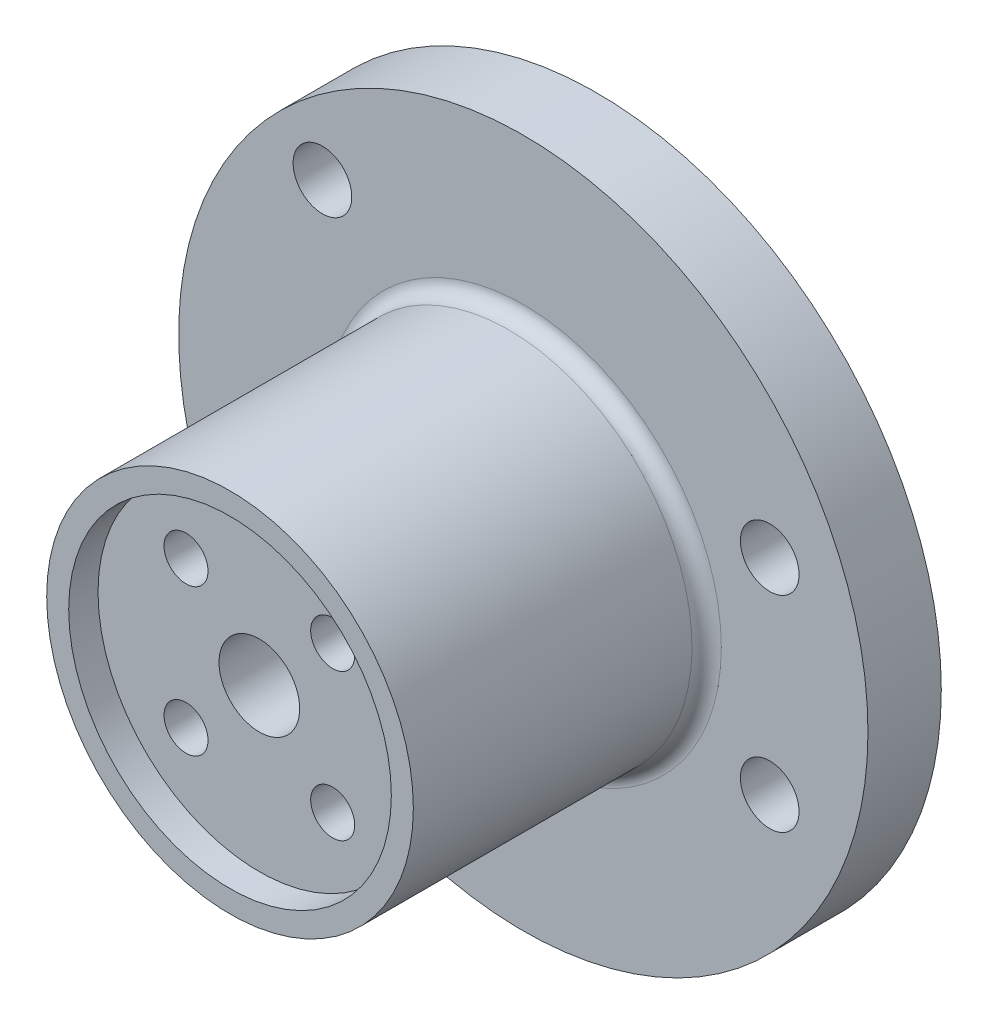
ISO-10303-21;
HEADER;
FILE_DESCRIPTION(('STEP AP214'),'2;1');
FILE_NAME('part.step','',(''),(''),'','','');
FILE_SCHEMA(('AUTOMOTIVE_DESIGN { 1 0 10303 214 1 1 1 1 }'));
ENDSEC;
DATA;
#1=APPLICATION_CONTEXT('core data for automotive mechanical design processes');
#2=APPLICATION_PROTOCOL_DEFINITION('international standard','automotive_design',2000,#1);
#3=PRODUCT_CONTEXT('',#1,'mechanical');
#4=PRODUCT('Part','Part','',(#3));
#5=PRODUCT_RELATED_PRODUCT_CATEGORY('part','',(#4));
#6=PRODUCT_DEFINITION_FORMATION('','',#4);
#7=PRODUCT_DEFINITION_CONTEXT('part definition',#1,'design');
#8=PRODUCT_DEFINITION('design','',#6,#7);
#9=PRODUCT_DEFINITION_SHAPE('','',#8);
#10=(LENGTH_UNIT() NAMED_UNIT(*) SI_UNIT(.MILLI.,.METRE.));
#11=(NAMED_UNIT(*) PLANE_ANGLE_UNIT() SI_UNIT($,.RADIAN.));
#12=(NAMED_UNIT(*) SI_UNIT($,.STERADIAN.) SOLID_ANGLE_UNIT());
#13=UNCERTAINTY_MEASURE_WITH_UNIT(LENGTH_MEASURE(1.E-05),#10,'distance_accuracy_value','');
#14=(GEOMETRIC_REPRESENTATION_CONTEXT(3) GLOBAL_UNCERTAINTY_ASSIGNED_CONTEXT((#13)) GLOBAL_UNIT_ASSIGNED_CONTEXT((#10,
#11,#12)) REPRESENTATION_CONTEXT('',''));
#15=CARTESIAN_POINT('',(0.,0.,0.));
#16=DIRECTION('',(0.,0.,1.));
#17=DIRECTION('',(1.,0.,0.));
#18=AXIS2_PLACEMENT_3D('',#15,#16,#17);
#19=CARTESIAN_POINT('',(0.,-29.8340703930584,6.));
#20=DIRECTION('',(0.,0.,1.));
#21=DIRECTION('',(1.,0.,0.));
#22=AXIS2_PLACEMENT_3D('',#19,#20,#21);
#23=TOROIDAL_SURFACE('',#22,13.5,1.);
#24=CARTESIAN_POINT('',(0.,-29.8340703930584,6.));
#25=DIRECTION('',(0.,0.,1.));
#26=DIRECTION('',(1.,0.,0.));
#27=AXIS2_PLACEMENT_3D('',#24,#25,#26);
#28=CIRCLE('',#27,12.5);
#29=CARTESIAN_POINT('',(-12.40650072647,-31.360091272364,5.99999999999442));
#30=VERTEX_POINT('',#29);
#31=CARTESIAN_POINT('',(-12.3661631385171,-28.009787182704,6.));
#32=VERTEX_POINT('',#31);
#33=EDGE_CURVE('E175',#30,#32,#28,.T.);
#34=ORIENTED_EDGE('',*,*,#33,.F.);
#35=CARTESIAN_POINT('',(-13.3554561895985,-31.8042962602411,5.));
#36=CARTESIAN_POINT('',(-13.3292068947137,-31.7997184325011,4.99999850446996));
#37=CARTESIAN_POINT('',(-13.3030646975041,-31.7946124959136,5.00106493962902));
#38=CARTESIAN_POINT('',(-13.2511789138633,-31.7834072289094,5.0053014427434));
#39=CARTESIAN_POINT('',(-13.2254351480004,-31.7773083608055,5.0084705337958));
#40=CARTESIAN_POINT('',(-13.1493376434393,-31.7576857602603,5.02103607347123));
#41=CARTESIAN_POINT('',(-13.0998084479632,-31.7427813223031,5.03349164906623));
#42=CARTESIAN_POINT('',(-13.0044248926745,-31.7101652013147,5.06595625826841));
#43=CARTESIAN_POINT('',(-12.9585655251529,-31.6924574454327,5.08595477840818));
#44=CARTESIAN_POINT('',(-12.871232035897,-31.6552251669885,5.13277486464714));
#45=CARTESIAN_POINT('',(-12.8297629554166,-31.6356986032597,5.15960415657287));
#46=CARTESIAN_POINT('',(-12.7491538733143,-31.5945986229179,5.22139124017293));
#47=CARTESIAN_POINT('',(-12.7103707653643,-31.5729768394816,5.25678147737277));
#48=CARTESIAN_POINT('',(-12.6389926718412,-31.5304005373566,5.33373846242347));
#49=CARTESIAN_POINT('',(-12.6064037908923,-31.5094466936945,5.37531123220725));
#50=CARTESIAN_POINT('',(-12.5454399584442,-31.4681256694827,5.46768145986754));
#51=CARTESIAN_POINT('',(-12.5176563243858,-31.4479587599013,5.51896213681349));
#52=CARTESIAN_POINT('',(-12.4708135773237,-31.4126000264803,5.62688430991694));
#53=CARTESIAN_POINT('',(-12.4517307212237,-31.3973946959248,5.6835107018308));
#54=CARTESIAN_POINT('',(-12.4308995728189,-31.3804524020772,5.76873220725052));
#55=CARTESIAN_POINT('',(-12.4253611379429,-31.3758817641364,5.79589210294517));
#56=CARTESIAN_POINT('',(-12.4163612546308,-31.3684015010736,5.85078476788693));
#57=CARTESIAN_POINT('',(-12.4128994134233,-31.3654915618485,5.87851742777301));
#58=CARTESIAN_POINT('',(-12.4080921945597,-31.3614419425646,5.93454876858016));
#59=CARTESIAN_POINT('',(-12.4067663182499,-31.3603185750688,5.9628503024696));
#60=CARTESIAN_POINT('',(-12.4063061253253,-31.3599241060825,6.01950862829392));
#61=CARTESIAN_POINT('',(-12.4071737458626,-31.3606546418396,6.04786544695758));
#62=CARTESIAN_POINT('',(-12.4091464904235,-31.3623287039546,6.07609289479795));
#63=B_SPLINE_CURVE_WITH_KNOTS('',3,(#35,#36,#37,#38,#39,#40,#41,#42,#43,#44,#45,#46,#47,#48,#49,
#50,#51,#52,#53,#54,#55,#56,#57,#58,#59,#60,#61,#62),.UNSPECIFIED.,.F.,.F.,(4,2,2,2,2,2,2,2,2,2,
2,2,2,4),(0.,0.0798815939149104,0.159726100463871,0.318486078900469,0.477025588195234,
0.635745213678908,0.805391891249494,0.975204904268246,1.15941157978579,1.34311252983149,
1.4272840659603,1.5114396766743,1.59635936012578,1.68135406524653),.UNSPECIFIED.);
#64=CARTESIAN_POINT('',(-13.3554561895985,-31.8042962602411,5.));
#65=VERTEX_POINT('',#64);
#66=EDGE_CURVE('E82',#30,#65,#63,.F.);
#67=ORIENTED_EDGE('',*,*,#66,.T.);
#68=CARTESIAN_POINT('',(0.,-29.8340703930584,5.));
#69=DIRECTION('',(0.,0.,1.));
#70=DIRECTION('',(1.,0.,0.));
#71=AXIS2_PLACEMENT_3D('',#68,#69,#70);
#72=CIRCLE('',#71,13.5);
#73=CARTESIAN_POINT('',(-13.3554561895985,-27.8638445258757,5.));
#74=VERTEX_POINT('',#73);
#75=EDGE_CURVE('E177',#74,#65,#72,.F.);
#76=ORIENTED_EDGE('',*,*,#75,.F.);
#77=CARTESIAN_POINT('',(-13.3554561895985,-27.8638445258757,5.));
#78=CARTESIAN_POINT('',(-13.3292068947137,-27.8684223536157,4.99999850446996));
#79=CARTESIAN_POINT('',(-13.3030646975041,-27.8735282902032,5.00106493962902));
#80=CARTESIAN_POINT('',(-13.2511789138633,-27.8847335572073,5.0053014427434));
#81=CARTESIAN_POINT('',(-13.2254351480004,-27.8908324253113,5.0084705337958));
#82=CARTESIAN_POINT('',(-13.1493376434393,-27.9104550258564,5.02103607347123));
#83=CARTESIAN_POINT('',(-13.0998084479632,-27.9253594638136,5.03349164906623));
#84=CARTESIAN_POINT('',(-13.0044248926745,-27.957975584802,5.06595625826841));
#85=CARTESIAN_POINT('',(-12.9585655251529,-27.975683340684,5.08595477840818));
#86=CARTESIAN_POINT('',(-12.871232035897,-28.0129156191282,5.13277486464714));
#87=CARTESIAN_POINT('',(-12.8297629554166,-28.032442182857,5.15960415657288));
#88=CARTESIAN_POINT('',(-12.7491538733143,-28.0735421631989,5.22139124017293));
#89=CARTESIAN_POINT('',(-12.7103707653643,-28.0951639466351,5.25678147737278));
#90=CARTESIAN_POINT('',(-12.6389926718412,-28.1377402487602,5.33373846242347));
#91=CARTESIAN_POINT('',(-12.6064037908923,-28.1586940924222,5.37531123220725));
#92=CARTESIAN_POINT('',(-12.5454399584442,-28.2000151166341,5.46768145986754));
#93=CARTESIAN_POINT('',(-12.5176563243858,-28.2201820262154,5.51896213681349));
#94=CARTESIAN_POINT('',(-12.4708135773237,-28.2555407596364,5.62688430991694));
#95=CARTESIAN_POINT('',(-12.4517307212237,-28.2707460901919,5.6835107018308));
#96=CARTESIAN_POINT('',(-12.4308995728189,-28.2876883840395,5.76873220725053));
#97=CARTESIAN_POINT('',(-12.4253611379429,-28.2922590219804,5.79589210294518));
#98=CARTESIAN_POINT('',(-12.4163612546308,-28.2997392850432,5.85078476788693));
#99=CARTESIAN_POINT('',(-12.4128994134233,-28.3026492242683,5.87851742777301));
#100=CARTESIAN_POINT('',(-12.4080921945597,-28.3066988435521,5.93454876858016));
#101=CARTESIAN_POINT('',(-12.4067663182499,-28.3078222110479,5.96285030246961));
#102=CARTESIAN_POINT('',(-12.4063061253253,-28.3082166800342,6.01950862829392));
#103=CARTESIAN_POINT('',(-12.4071737458626,-28.3074861442771,6.04786544695759));
#104=CARTESIAN_POINT('',(-12.4091464904235,-28.3058120821621,6.07609289479795));
#105=B_SPLINE_CURVE_WITH_KNOTS('',3,(#77,#78,#79,#80,#81,#82,#83,#84,#85,#86,#87,#88,#89,#90,
#91,#92,#93,#94,#95,#96,#97,#98,#99,#100,#101,#102,#103,#104),.UNSPECIFIED.,.F.,.F.,(4,2,2,2,2,
2,2,2,2,2,2,2,2,4),(0.,0.0798815939149111,0.159726100463873,0.318486078900472,0.477025588195239,
0.635745213678914,0.805391891249495,0.975204904268246,1.15941157978579,1.3431125298315,
1.4272840659603,1.5114396766743,1.59635936012579,1.68135406524653),.UNSPECIFIED.);
#106=CARTESIAN_POINT('',(-12.406500726471,-28.3080495137533,5.99999999999442));
#107=VERTEX_POINT('',#106);
#108=EDGE_CURVE('E12',#74,#107,#105,.T.);
#109=ORIENTED_EDGE('',*,*,#108,.T.);
#110=CARTESIAN_POINT('',(0.,-29.8340703930584,6.));
#111=DIRECTION('',(0.,0.,1.));
#112=DIRECTION('',(1.,0.,0.));
#113=AXIS2_PLACEMENT_3D('',#110,#111,#112);
#114=CIRCLE('',#113,12.5);
#115=EDGE_CURVE('E123',#32,#107,#114,.T.);
#116=ORIENTED_EDGE('',*,*,#115,.F.);
#117=EDGE_LOOP('',(#34,#67,#76,#109,#116));
#118=FACE_BOUND('',#117,.T.);
#119=ADVANCED_FACE('F69',(#118),#23,.F.);
#120=CARTESIAN_POINT('',(-5.00000000000002,-24.8340703930584,0.));
#121=DIRECTION('',(0.,0.,1.));
#122=DIRECTION('',(1.,0.,0.));
#123=AXIS2_PLACEMENT_3D('',#120,#121,#122);
#124=CYLINDRICAL_SURFACE('',#123,1.5);
#125=CARTESIAN_POINT('',(-5.00000000000002,-24.8340703930584,23.));
#126=DIRECTION('',(0.,0.,1.));
#127=DIRECTION('',(1.,0.,0.));
#128=AXIS2_PLACEMENT_3D('',#125,#126,#127);
#129=CIRCLE('',#128,1.5);
#130=CARTESIAN_POINT('',(-3.50000000000002,-24.8340703930584,23.));
#131=VERTEX_POINT('',#130);
#132=EDGE_CURVE('E129',#131,#131,#129,.F.);
#133=ORIENTED_EDGE('',*,*,#132,.F.);
#134=EDGE_LOOP('',(#133));
#135=FACE_BOUND('',#134,.T.);
#136=CARTESIAN_POINT('',(-5.00000000000002,-24.8340703930584,20.));
#137=DIRECTION('',(0.,0.,-1.));
#138=DIRECTION('',(-1.,0.,0.));
#139=AXIS2_PLACEMENT_3D('',#136,#137,#138);
#140=CIRCLE('',#139,1.5);
#141=CARTESIAN_POINT('',(-6.50000000000003,-24.8340703930584,20.));
#142=VERTEX_POINT('',#141);
#143=EDGE_CURVE('E260',#142,#142,#140,.F.);
#144=ORIENTED_EDGE('',*,*,#143,.F.);
#145=EDGE_LOOP('',(#144));
#146=FACE_BOUND('',#145,.T.);
#147=ADVANCED_FACE('F217',(#135,#146),#124,.F.);
#148=CARTESIAN_POINT('',(-5.00000000000003,-34.8340703930584,0.));
#149=DIRECTION('',(0.,0.,1.));
#150=DIRECTION('',(1.,0.,0.));
#151=AXIS2_PLACEMENT_3D('',#148,#149,#150);
#152=CYLINDRICAL_SURFACE('',#151,1.5);
#153=CARTESIAN_POINT('',(-5.00000000000003,-34.8340703930584,23.));
#154=DIRECTION('',(0.,0.,1.));
#155=DIRECTION('',(1.,0.,0.));
#156=AXIS2_PLACEMENT_3D('',#153,#154,#155);
#157=CIRCLE('',#156,1.5);
#158=CARTESIAN_POINT('',(-3.50000000000003,-34.8340703930584,23.));
#159=VERTEX_POINT('',#158);
#160=EDGE_CURVE('E134',#159,#159,#157,.F.);
#161=ORIENTED_EDGE('',*,*,#160,.F.);
#162=EDGE_LOOP('',(#161));
#163=FACE_BOUND('',#162,.T.);
#164=CARTESIAN_POINT('',(-5.00000000000003,-34.8340703930584,20.));
#165=DIRECTION('',(0.,0.,-1.));
#166=DIRECTION('',(-1.,0.,0.));
#167=AXIS2_PLACEMENT_3D('',#164,#165,#166);
#168=CIRCLE('',#167,1.5);
#169=CARTESIAN_POINT('',(-6.50000000000003,-34.8340703930584,20.));
#170=VERTEX_POINT('',#169);
#171=EDGE_CURVE('E251',#170,#170,#168,.F.);
#172=ORIENTED_EDGE('',*,*,#171,.F.);
#173=EDGE_LOOP('',(#172));
#174=FACE_BOUND('',#173,.T.);
#175=ADVANCED_FACE('F222',(#163,#174),#152,.F.);
#176=CARTESIAN_POINT('',(4.99999999999997,-34.8340703930584,0.));
#177=DIRECTION('',(0.,0.,1.));
#178=DIRECTION('',(1.,0.,0.));
#179=AXIS2_PLACEMENT_3D('',#176,#177,#178);
#180=CYLINDRICAL_SURFACE('',#179,1.5);
#181=CARTESIAN_POINT('',(4.99999999999997,-34.8340703930584,23.));
#182=DIRECTION('',(0.,0.,1.));
#183=DIRECTION('',(1.,0.,0.));
#184=AXIS2_PLACEMENT_3D('',#181,#182,#183);
#185=CIRCLE('',#184,1.5);
#186=CARTESIAN_POINT('',(6.49999999999997,-34.8340703930584,23.));
#187=VERTEX_POINT('',#186);
#188=EDGE_CURVE('E172',#187,#187,#185,.F.);
#189=ORIENTED_EDGE('',*,*,#188,.F.);
#190=EDGE_LOOP('',(#189));
#191=FACE_BOUND('',#190,.T.);
#192=CARTESIAN_POINT('',(4.99999999999997,-34.8340703930584,20.));
#193=DIRECTION('',(0.,0.,-1.));
#194=DIRECTION('',(-1.,0.,0.));
#195=AXIS2_PLACEMENT_3D('',#192,#193,#194);
#196=CIRCLE('',#195,1.5);
#197=CARTESIAN_POINT('',(3.49999999999997,-34.8340703930584,20.));
#198=VERTEX_POINT('',#197);
#199=EDGE_CURVE('E271',#198,#198,#196,.F.);
#200=ORIENTED_EDGE('',*,*,#199,.F.);
#201=EDGE_LOOP('',(#200));
#202=FACE_BOUND('',#201,.T.);
#203=ADVANCED_FACE('F211',(#191,#202),#180,.F.);
#204=CARTESIAN_POINT('',(4.99999999999997,-24.8340703930584,0.));
#205=DIRECTION('',(0.,0.,1.));
#206=DIRECTION('',(1.,0.,0.));
#207=AXIS2_PLACEMENT_3D('',#204,#205,#206);
#208=CYLINDRICAL_SURFACE('',#207,1.5);
#209=CARTESIAN_POINT('',(4.99999999999997,-24.8340703930584,23.));
#210=DIRECTION('',(0.,0.,1.));
#211=DIRECTION('',(1.,0.,0.));
#212=AXIS2_PLACEMENT_3D('',#209,#210,#211);
#213=CIRCLE('',#212,1.5);
#214=CARTESIAN_POINT('',(6.49999999999997,-24.8340703930584,23.));
#215=VERTEX_POINT('',#214);
#216=EDGE_CURVE('E169',#215,#215,#213,.F.);
#217=ORIENTED_EDGE('',*,*,#216,.F.);
#218=EDGE_LOOP('',(#217));
#219=FACE_BOUND('',#218,.T.);
#220=CARTESIAN_POINT('',(4.99999999999997,-24.8340703930584,20.));
#221=DIRECTION('',(0.,0.,-1.));
#222=DIRECTION('',(-1.,0.,0.));
#223=AXIS2_PLACEMENT_3D('',#220,#221,#222);
#224=CIRCLE('',#223,1.5);
#225=CARTESIAN_POINT('',(3.49999999999997,-24.8340703930584,20.));
#226=VERTEX_POINT('',#225);
#227=EDGE_CURVE('E278',#226,#226,#224,.F.);
#228=ORIENTED_EDGE('',*,*,#227,.F.);
#229=EDGE_LOOP('',(#228));
#230=FACE_BOUND('',#229,.T.);
#231=ADVANCED_FACE('F206',(#219,#230),#208,.F.);
#232=CARTESIAN_POINT('',(0.,-29.8340703930584,5.));
#233=DIRECTION('',(0.,0.,-1.));
#234=DIRECTION('',(-1.,0.,0.));
#235=AXIS2_PLACEMENT_3D('',#232,#233,#234);
#236=CYLINDRICAL_SURFACE('',#235,23.5);
#237=CARTESIAN_POINT('',(0.,-29.8340703930584,5.));
#238=DIRECTION('',(0.,0.,1.));
#239=DIRECTION('',(1.,0.,0.));
#240=AXIS2_PLACEMENT_3D('',#237,#238,#239);
#241=CIRCLE('',#240,23.5);
#242=CARTESIAN_POINT('',(23.5,-29.8340703930584,5.));
#243=VERTEX_POINT('',#242);
#244=EDGE_CURVE('E163',#243,#243,#241,.T.);
#245=ORIENTED_EDGE('',*,*,#244,.F.);
#246=EDGE_LOOP('',(#245));
#247=FACE_BOUND('',#246,.T.);
#248=CARTESIAN_POINT('',(0.,-29.8340703930584,0.));
#249=DIRECTION('',(0.,0.,1.));
#250=DIRECTION('',(1.,0.,0.));
#251=AXIS2_PLACEMENT_3D('',#248,#249,#250);
#252=CIRCLE('',#251,23.5);
#253=CARTESIAN_POINT('',(23.5,-29.8340703930584,0.));
#254=VERTEX_POINT('',#253);
#255=EDGE_CURVE('E140',#254,#254,#252,.T.);
#256=ORIENTED_EDGE('',*,*,#255,.T.);
#257=EDGE_LOOP('',(#256));
#258=FACE_BOUND('',#257,.T.);
#259=ADVANCED_FACE('F201',(#247,#258),#236,.T.);
#260=CARTESIAN_POINT('',(0.,-29.8340703930584,5.));
#261=DIRECTION('',(0.,0.,1.));
#262=DIRECTION('',(1.,0.,0.));
#263=AXIS2_PLACEMENT_3D('',#260,#261,#262);
#264=PLANE('',#263);
#265=CARTESIAN_POINT('',(-13.6992730482373,-29.8340703930584,5.));
#266=DIRECTION('',(0.,0.,-1.));
#267=DIRECTION('',(-1.,0.,0.));
#268=AXIS2_PLACEMENT_3D('',#265,#266,#267);
#269=CIRCLE('',#268,2.);
#270=EDGE_CURVE('E118',#65,#74,#269,.T.);
#271=ORIENTED_EDGE('',*,*,#270,.T.);
#272=ORIENTED_EDGE('',*,*,#75,.T.);
#273=EDGE_LOOP('',(#271,#272));
#274=FACE_BOUND('',#273,.T.);
#275=CARTESIAN_POINT('',(-13.6992730482373,-15.8340703930584,5.));
#276=DIRECTION('',(0.,0.,-1.));
#277=DIRECTION('',(-1.,0.,0.));
#278=AXIS2_PLACEMENT_3D('',#275,#276,#277);
#279=CIRCLE('',#278,2.);
#280=CARTESIAN_POINT('',(-15.6992730482373,-15.8340703930584,5.));
#281=VERTEX_POINT('',#280);
#282=EDGE_CURVE('E137',#281,#281,#279,.T.);
#283=ORIENTED_EDGE('',*,*,#282,.T.);
#284=EDGE_LOOP('',(#283));
#285=FACE_BOUND('',#284,.T.);
#286=CARTESIAN_POINT('',(16.8007269517627,-36.8840703930584,5.));
#287=DIRECTION('',(0.,0.,-1.));
#288=DIRECTION('',(-1.,0.,0.));
#289=AXIS2_PLACEMENT_3D('',#286,#287,#288);
#290=CIRCLE('',#289,2.);
#291=CARTESIAN_POINT('',(14.8007269517627,-36.8840703930584,5.));
#292=VERTEX_POINT('',#291);
#293=EDGE_CURVE('E117',#292,#292,#290,.T.);
#294=ORIENTED_EDGE('',*,*,#293,.T.);
#295=EDGE_LOOP('',(#294));
#296=FACE_BOUND('',#295,.T.);
#297=CARTESIAN_POINT('',(16.8007269517627,-22.8840703930584,5.));
#298=DIRECTION('',(0.,0.,-1.));
#299=DIRECTION('',(-1.,0.,0.));
#300=AXIS2_PLACEMENT_3D('',#297,#298,#299);
#301=CIRCLE('',#300,2.);
#302=CARTESIAN_POINT('',(14.8007269517627,-22.8840703930584,5.));
#303=VERTEX_POINT('',#302);
#304=EDGE_CURVE('E148',#303,#303,#301,.T.);
#305=ORIENTED_EDGE('',*,*,#304,.T.);
#306=EDGE_LOOP('',(#305));
#307=FACE_BOUND('',#306,.T.);
#308=CARTESIAN_POINT('',(-13.6992730482373,-43.8340703930584,5.));
#309=DIRECTION('',(0.,0.,-1.));
#310=DIRECTION('',(-1.,0.,0.));
#311=AXIS2_PLACEMENT_3D('',#308,#309,#310);
#312=CIRCLE('',#311,2.);
#313=CARTESIAN_POINT('',(-15.6992730482373,-43.8340703930584,5.));
#314=VERTEX_POINT('',#313);
#315=EDGE_CURVE('E155',#314,#314,#312,.T.);
#316=ORIENTED_EDGE('',*,*,#315,.T.);
#317=EDGE_LOOP('',(#316));
#318=FACE_BOUND('',#317,.T.);
#319=ORIENTED_EDGE('',*,*,#244,.T.);
#320=EDGE_LOOP('',(#319));
#321=FACE_BOUND('',#320,.T.);
#322=ADVANCED_FACE('F198',(#274,#285,#296,#307,#318,#321),#264,.T.);
#323=CARTESIAN_POINT('',(0.,-29.8340703930584,0.));
#324=DIRECTION('',(0.,0.,1.));
#325=DIRECTION('',(1.,0.,0.));
#326=AXIS2_PLACEMENT_3D('',#323,#324,#325);
#327=PLANE('',#326);
#328=CARTESIAN_POINT('',(-5.00000000000005,-24.8340703930581,0.));
#329=DIRECTION('',(0.,0.,-1.));
#330=DIRECTION('',(-1.,0.,0.));
#331=AXIS2_PLACEMENT_3D('',#328,#329,#330);
#332=CIRCLE('',#331,2.75);
#333=CARTESIAN_POINT('',(-7.75000000000005,-24.8340703930581,0.));
#334=VERTEX_POINT('',#333);
#335=EDGE_CURVE('E264',#334,#334,#332,.T.);
#336=ORIENTED_EDGE('',*,*,#335,.F.);
#337=EDGE_LOOP('',(#336));
#338=FACE_BOUND('',#337,.T.);
#339=CARTESIAN_POINT('',(4.99999999999974,-34.8340703930583,0.));
#340=DIRECTION('',(0.,0.,-1.));
#341=DIRECTION('',(-1.,0.,0.));
#342=AXIS2_PLACEMENT_3D('',#339,#340,#341);
#343=CIRCLE('',#342,2.75);
#344=CARTESIAN_POINT('',(2.24999999999974,-34.8340703930583,0.));
#345=VERTEX_POINT('',#344);
#346=EDGE_CURVE('E257',#345,#345,#343,.T.);
#347=ORIENTED_EDGE('',*,*,#346,.F.);
#348=EDGE_LOOP('',(#347));
#349=FACE_BOUND('',#348,.T.);
#350=CARTESIAN_POINT('',(-5.00000000000028,-34.8340703930581,0.));
#351=DIRECTION('',(0.,0.,-1.));
#352=DIRECTION('',(-1.,0.,0.));
#353=AXIS2_PLACEMENT_3D('',#350,#351,#352);
#354=CIRCLE('',#353,2.75);
#355=CARTESIAN_POINT('',(-7.75000000000028,-34.8340703930581,0.));
#356=VERTEX_POINT('',#355);
#357=EDGE_CURVE('E248',#356,#356,#354,.T.);
#358=ORIENTED_EDGE('',*,*,#357,.F.);
#359=EDGE_LOOP('',(#358));
#360=FACE_BOUND('',#359,.T.);
#361=CARTESIAN_POINT('',(4.99999999999997,-24.8340703930584,0.));
#362=DIRECTION('',(0.,0.,-1.));
#363=DIRECTION('',(-1.,0.,0.));
#364=AXIS2_PLACEMENT_3D('',#361,#362,#363);
#365=CIRCLE('',#364,2.75);
#366=CARTESIAN_POINT('',(2.24999999999997,-24.8340703930584,0.));
#367=VERTEX_POINT('',#366);
#368=EDGE_CURVE('E267',#367,#367,#365,.T.);
#369=ORIENTED_EDGE('',*,*,#368,.F.);
#370=EDGE_LOOP('',(#369));
#371=FACE_BOUND('',#370,.T.);
#372=CARTESIAN_POINT('',(-13.6992730482373,-15.8340703930584,0.));
#373=DIRECTION('',(0.,0.,-1.));
#374=DIRECTION('',(-1.,0.,0.));
#375=AXIS2_PLACEMENT_3D('',#372,#373,#374);
#376=CIRCLE('',#375,2.);
#377=CARTESIAN_POINT('',(-15.6992730482373,-15.8340703930584,0.));
#378=VERTEX_POINT('',#377);
#379=EDGE_CURVE('E141',#378,#378,#376,.T.);
#380=ORIENTED_EDGE('',*,*,#379,.F.);
#381=EDGE_LOOP('',(#380));
#382=FACE_BOUND('',#381,.T.);
#383=CARTESIAN_POINT('',(-13.6992730482373,-29.8340703930584,0.));
#384=DIRECTION('',(0.,0.,-1.));
#385=DIRECTION('',(-1.,0.,0.));
#386=AXIS2_PLACEMENT_3D('',#383,#384,#385);
#387=CIRCLE('',#386,2.);
#388=CARTESIAN_POINT('',(-12.406500726471,-31.3600912723634,0.));
#389=VERTEX_POINT('',#388);
#390=CARTESIAN_POINT('',(-12.406500726471,-28.3080495137533,0.));
#391=VERTEX_POINT('',#390);
#392=EDGE_CURVE('E110',#389,#391,#387,.T.);
#393=ORIENTED_EDGE('',*,*,#392,.F.);
#394=CARTESIAN_POINT('',(0.,-29.8340703930584,0.));
#395=DIRECTION('',(0.,0.,-1.));
#396=DIRECTION('',(-1.,0.,0.));
#397=AXIS2_PLACEMENT_3D('',#394,#395,#396);
#398=CIRCLE('',#397,12.5);
#399=EDGE_CURVE('E115',#389,#391,#398,.T.);
#400=ORIENTED_EDGE('',*,*,#399,.T.);
#401=EDGE_LOOP('',(#393,#400));
#402=FACE_BOUND('',#401,.T.);
#403=CARTESIAN_POINT('',(16.8007269517627,-36.8840703930584,0.));
#404=DIRECTION('',(0.,0.,-1.));
#405=DIRECTION('',(-1.,0.,0.));
#406=AXIS2_PLACEMENT_3D('',#403,#404,#405);
#407=CIRCLE('',#406,2.);
#408=CARTESIAN_POINT('',(14.8007269517627,-36.8840703930584,0.));
#409=VERTEX_POINT('',#408);
#410=EDGE_CURVE('E145',#409,#409,#407,.T.);
#411=ORIENTED_EDGE('',*,*,#410,.F.);
#412=EDGE_LOOP('',(#411));
#413=FACE_BOUND('',#412,.T.);
#414=CARTESIAN_POINT('',(16.8007269517627,-22.8840703930584,0.));
#415=DIRECTION('',(0.,0.,-1.));
#416=DIRECTION('',(-1.,0.,0.));
#417=AXIS2_PLACEMENT_3D('',#414,#415,#416);
#418=CIRCLE('',#417,2.);
#419=CARTESIAN_POINT('',(14.8007269517627,-22.8840703930584,0.));
#420=VERTEX_POINT('',#419);
#421=EDGE_CURVE('E158',#420,#420,#418,.T.);
#422=ORIENTED_EDGE('',*,*,#421,.F.);
#423=EDGE_LOOP('',(#422));
#424=FACE_BOUND('',#423,.T.);
#425=CARTESIAN_POINT('',(-13.6992730482373,-43.8340703930584,0.));
#426=DIRECTION('',(0.,0.,-1.));
#427=DIRECTION('',(-1.,0.,0.));
#428=AXIS2_PLACEMENT_3D('',#425,#426,#427);
#429=CIRCLE('',#428,2.);
#430=CARTESIAN_POINT('',(-15.6992730482373,-43.8340703930584,0.));
#431=VERTEX_POINT('',#430);
#432=EDGE_CURVE('E144',#431,#431,#429,.T.);
#433=ORIENTED_EDGE('',*,*,#432,.F.);
#434=EDGE_LOOP('',(#433));
#435=FACE_BOUND('',#434,.T.);
#436=ORIENTED_EDGE('',*,*,#255,.F.);
#437=EDGE_LOOP('',(#436));
#438=FACE_BOUND('',#437,.T.);
#439=CARTESIAN_POINT('',(0.,-29.8340703930584,0.));
#440=DIRECTION('',(0.,0.,-1.));
#441=DIRECTION('',(-1.,0.,0.));
#442=AXIS2_PLACEMENT_3D('',#439,#440,#441);
#443=CIRCLE('',#442,2.75);
#444=CARTESIAN_POINT('',(-2.75000000000003,-29.8340703930584,0.));
#445=VERTEX_POINT('',#444);
#446=EDGE_CURVE('E243',#445,#445,#443,.T.);
#447=ORIENTED_EDGE('',*,*,#446,.F.);
#448=EDGE_LOOP('',(#447));
#449=FACE_BOUND('',#448,.T.);
#450=ADVANCED_FACE('F112',(#338,#349,#360,#371,#382,#402,#413,#424,#435,#438,#449),#327,.F.);
#451=CARTESIAN_POINT('',(-13.6992730482373,-43.8340703930584,5.));
#452=DIRECTION('',(0.,0.,-1.));
#453=DIRECTION('',(-1.,0.,0.));
#454=AXIS2_PLACEMENT_3D('',#451,#452,#453);
#455=CYLINDRICAL_SURFACE('',#454,2.);
#456=ORIENTED_EDGE('',*,*,#315,.F.);
#457=EDGE_LOOP('',(#456));
#458=FACE_BOUND('',#457,.T.);
#459=ORIENTED_EDGE('',*,*,#432,.T.);
#460=EDGE_LOOP('',(#459));
#461=FACE_BOUND('',#460,.T.);
#462=ADVANCED_FACE('F189',(#458,#461),#455,.F.);
#463=CARTESIAN_POINT('',(16.8007269517627,-22.8840703930584,5.));
#464=DIRECTION('',(0.,0.,-1.));
#465=DIRECTION('',(-1.,0.,0.));
#466=AXIS2_PLACEMENT_3D('',#463,#464,#465);
#467=CYLINDRICAL_SURFACE('',#466,2.);
#468=ORIENTED_EDGE('',*,*,#304,.F.);
#469=EDGE_LOOP('',(#468));
#470=FACE_BOUND('',#469,.T.);
#471=ORIENTED_EDGE('',*,*,#421,.T.);
#472=EDGE_LOOP('',(#471));
#473=FACE_BOUND('',#472,.T.);
#474=ADVANCED_FACE('F193',(#470,#473),#467,.F.);
#475=CARTESIAN_POINT('',(16.8007269517627,-36.8840703930584,5.));
#476=DIRECTION('',(0.,0.,-1.));
#477=DIRECTION('',(-1.,0.,0.));
#478=AXIS2_PLACEMENT_3D('',#475,#476,#477);
#479=CYLINDRICAL_SURFACE('',#478,2.);
#480=ORIENTED_EDGE('',*,*,#293,.F.);
#481=EDGE_LOOP('',(#480));
#482=FACE_BOUND('',#481,.T.);
#483=ORIENTED_EDGE('',*,*,#410,.T.);
#484=EDGE_LOOP('',(#483));
#485=FACE_BOUND('',#484,.T.);
#486=ADVANCED_FACE('F187',(#482,#485),#479,.F.);
#487=CARTESIAN_POINT('',(-13.6992730482373,-29.8340703930584,5.));
#488=DIRECTION('',(0.,0.,-1.));
#489=DIRECTION('',(-1.,0.,0.));
#490=AXIS2_PLACEMENT_3D('',#487,#488,#489);
#491=CYLINDRICAL_SURFACE('',#490,2.);
#492=ORIENTED_EDGE('',*,*,#270,.F.);
#493=ORIENTED_EDGE('',*,*,#66,.F.);
#494=DIRECTION('',(0.,0.,-1.));
#495=VECTOR('',#494,1.);
#496=CARTESIAN_POINT('',(-12.406500726471,-31.3600912723634,12.5));
#497=LINE('',#496,#495);
#498=EDGE_CURVE('E120',#30,#389,#497,.T.);
#499=ORIENTED_EDGE('',*,*,#498,.T.);
#500=ORIENTED_EDGE('',*,*,#392,.T.);
#501=DIRECTION('',(0.,0.,-1.));
#502=VECTOR('',#501,1.);
#503=CARTESIAN_POINT('',(-12.406500726471,-28.3080495137533,12.5));
#504=LINE('',#503,#502);
#505=EDGE_CURVE('E124',#391,#107,#504,.F.);
#506=ORIENTED_EDGE('',*,*,#505,.T.);
#507=ORIENTED_EDGE('',*,*,#108,.F.);
#508=EDGE_LOOP('',(#492,#493,#499,#500,#506,#507));
#509=FACE_BOUND('',#508,.T.);
#510=ADVANCED_FACE('F121',(#509),#491,.F.);
#511=CARTESIAN_POINT('',(-13.6992730482373,-15.8340703930584,5.));
#512=DIRECTION('',(0.,0.,-1.));
#513=DIRECTION('',(-1.,0.,0.));
#514=AXIS2_PLACEMENT_3D('',#511,#512,#513);
#515=CYLINDRICAL_SURFACE('',#514,2.);
#516=ORIENTED_EDGE('',*,*,#282,.F.);
#517=EDGE_LOOP('',(#516));
#518=FACE_BOUND('',#517,.T.);
#519=ORIENTED_EDGE('',*,*,#379,.T.);
#520=EDGE_LOOP('',(#519));
#521=FACE_BOUND('',#520,.T.);
#522=ADVANCED_FACE('F186',(#518,#521),#515,.F.);
#523=CARTESIAN_POINT('',(0.,-29.8340703930584,25.));
#524=DIRECTION('',(0.,0.,-1.));
#525=DIRECTION('',(-1.,0.,0.));
#526=AXIS2_PLACEMENT_3D('',#523,#524,#525);
#527=CYLINDRICAL_SURFACE('',#526,12.5);
#528=CARTESIAN_POINT('',(0.,-29.8340703930584,25.));
#529=DIRECTION('',(0.,0.,-1.));
#530=DIRECTION('',(-1.,0.,0.));
#531=AXIS2_PLACEMENT_3D('',#528,#529,#530);
#532=CIRCLE('',#531,12.5);
#533=CARTESIAN_POINT('',(-12.5,-29.8340703930584,25.));
#534=VERTEX_POINT('',#533);
#535=EDGE_CURVE('E128',#534,#534,#532,.T.);
#536=ORIENTED_EDGE('',*,*,#535,.T.);
#537=EDGE_LOOP('',(#536));
#538=FACE_BOUND('',#537,.T.);
#539=ORIENTED_EDGE('',*,*,#498,.F.);
#540=ORIENTED_EDGE('',*,*,#33,.T.);
#541=ORIENTED_EDGE('',*,*,#115,.T.);
#542=ORIENTED_EDGE('',*,*,#505,.F.);
#543=ORIENTED_EDGE('',*,*,#399,.F.);
#544=EDGE_LOOP('',(#539,#540,#541,#542,#543));
#545=FACE_BOUND('',#544,.T.);
#546=ADVANCED_FACE('F126',(#538,#545),#527,.T.);
#547=CARTESIAN_POINT('',(0.,-29.8340703930584,25.));
#548=DIRECTION('',(0.,0.,-1.));
#549=DIRECTION('',(-1.,0.,0.));
#550=AXIS2_PLACEMENT_3D('',#547,#548,#549);
#551=PLANE('',#550);
#552=CARTESIAN_POINT('',(0.,-29.8340703930584,25.));
#553=DIRECTION('',(0.,0.,1.));
#554=DIRECTION('',(1.,0.,0.));
#555=AXIS2_PLACEMENT_3D('',#552,#553,#554);
#556=CIRCLE('',#555,11.);
#557=CARTESIAN_POINT('',(11.,-29.8340703930584,25.));
#558=VERTEX_POINT('',#557);
#559=EDGE_CURVE('E284',#558,#558,#556,.T.);
#560=ORIENTED_EDGE('',*,*,#559,.F.);
#561=EDGE_LOOP('',(#560));
#562=FACE_BOUND('',#561,.T.);
#563=ORIENTED_EDGE('',*,*,#535,.F.);
#564=EDGE_LOOP('',(#563));
#565=FACE_BOUND('',#564,.T.);
#566=ADVANCED_FACE('F330',(#562,#565),#551,.F.);
#567=CARTESIAN_POINT('',(0.,-29.8340703930584,23.));
#568=DIRECTION('',(0.,0.,1.));
#569=DIRECTION('',(1.,0.,0.));
#570=AXIS2_PLACEMENT_3D('',#567,#568,#569);
#571=PLANE('',#570);
#572=CARTESIAN_POINT('',(0.,-29.8340703930584,23.));
#573=DIRECTION('',(0.,0.,1.));
#574=DIRECTION('',(1.,0.,0.));
#575=AXIS2_PLACEMENT_3D('',#572,#573,#574);
#576=CIRCLE('',#575,11.);
#577=CARTESIAN_POINT('',(11.,-29.8340703930584,23.));
#578=VERTEX_POINT('',#577);
#579=EDGE_CURVE('E173',#578,#578,#576,.T.);
#580=ORIENTED_EDGE('',*,*,#579,.T.);
#581=EDGE_LOOP('',(#580));
#582=FACE_BOUND('',#581,.T.);
#583=ORIENTED_EDGE('',*,*,#216,.T.);
#584=EDGE_LOOP('',(#583));
#585=FACE_BOUND('',#584,.T.);
#586=ORIENTED_EDGE('',*,*,#188,.T.);
#587=EDGE_LOOP('',(#586));
#588=FACE_BOUND('',#587,.T.);
#589=ORIENTED_EDGE('',*,*,#160,.T.);
#590=EDGE_LOOP('',(#589));
#591=FACE_BOUND('',#590,.T.);
#592=ORIENTED_EDGE('',*,*,#132,.T.);
#593=EDGE_LOOP('',(#592));
#594=FACE_BOUND('',#593,.T.);
#595=CARTESIAN_POINT('',(0.,-29.8340703930584,23.));
#596=DIRECTION('',(0.,0.,-1.));
#597=DIRECTION('',(-1.,0.,0.));
#598=AXIS2_PLACEMENT_3D('',#595,#596,#597);
#599=CIRCLE('',#598,2.75);
#600=CARTESIAN_POINT('',(-2.75000000000003,-29.8340703930584,23.));
#601=VERTEX_POINT('',#600);
#602=EDGE_CURVE('E245',#601,#601,#599,.T.);
#603=ORIENTED_EDGE('',*,*,#602,.T.);
#604=EDGE_LOOP('',(#603));
#605=FACE_BOUND('',#604,.T.);
#606=ADVANCED_FACE('F296',(#582,#585,#588,#591,#594,#605),#571,.T.);
#607=CARTESIAN_POINT('',(0.,-29.8340703930584,23.));
#608=DIRECTION('',(0.,0.,1.));
#609=DIRECTION('',(1.,0.,0.));
#610=AXIS2_PLACEMENT_3D('',#607,#608,#609);
#611=CYLINDRICAL_SURFACE('',#610,11.);
#612=ORIENTED_EDGE('',*,*,#579,.F.);
#613=EDGE_LOOP('',(#612));
#614=FACE_BOUND('',#613,.T.);
#615=ORIENTED_EDGE('',*,*,#559,.T.);
#616=EDGE_LOOP('',(#615));
#617=FACE_BOUND('',#616,.T.);
#618=ADVANCED_FACE('F339',(#614,#617),#611,.F.);
#619=CARTESIAN_POINT('',(4.99999999999997,-24.8340703930584,20.));
#620=DIRECTION('',(0.,0.,-1.));
#621=DIRECTION('',(-1.,0.,0.));
#622=AXIS2_PLACEMENT_3D('',#619,#620,#621);
#623=CYLINDRICAL_SURFACE('',#622,2.75);
#624=CARTESIAN_POINT('',(4.99999999999997,-24.8340703930584,20.));
#625=DIRECTION('',(0.,0.,-1.));
#626=DIRECTION('',(-1.,0.,0.));
#627=AXIS2_PLACEMENT_3D('',#624,#625,#626);
#628=CIRCLE('',#627,2.75);
#629=CARTESIAN_POINT('',(2.24999999999997,-24.8340703930584,20.));
#630=VERTEX_POINT('',#629);
#631=EDGE_CURVE('E281',#630,#630,#628,.T.);
#632=ORIENTED_EDGE('',*,*,#631,.F.);
#633=EDGE_LOOP('',(#632));
#634=FACE_BOUND('',#633,.T.);
#635=ORIENTED_EDGE('',*,*,#368,.T.);
#636=EDGE_LOOP('',(#635));
#637=FACE_BOUND('',#636,.T.);
#638=ADVANCED_FACE('F342',(#634,#637),#623,.F.);
#639=CARTESIAN_POINT('',(0.,0.,20.));
#640=DIRECTION('',(0.,0.,-1.));
#641=DIRECTION('',(-1.,0.,0.));
#642=AXIS2_PLACEMENT_3D('',#639,#640,#641);
#643=PLANE('',#642);
#644=ORIENTED_EDGE('',*,*,#227,.T.);
#645=EDGE_LOOP('',(#644));
#646=FACE_BOUND('',#645,.T.);
#647=ORIENTED_EDGE('',*,*,#631,.T.);
#648=EDGE_LOOP('',(#647));
#649=FACE_BOUND('',#648,.T.);
#650=ADVANCED_FACE('F314',(#646,#649),#643,.T.);
#651=CARTESIAN_POINT('',(-5.00000000000028,-34.8340703930581,20.));
#652=DIRECTION('',(0.,0.,-1.));
#653=DIRECTION('',(-1.,0.,0.));
#654=AXIS2_PLACEMENT_3D('',#651,#652,#653);
#655=CYLINDRICAL_SURFACE('',#654,2.75);
#656=CARTESIAN_POINT('',(-5.00000000000028,-34.8340703930581,20.));
#657=DIRECTION('',(0.,0.,-1.));
#658=DIRECTION('',(-1.,0.,0.));
#659=AXIS2_PLACEMENT_3D('',#656,#657,#658);
#660=CIRCLE('',#659,2.75);
#661=CARTESIAN_POINT('',(-7.75000000000028,-34.8340703930581,20.));
#662=VERTEX_POINT('',#661);
#663=EDGE_CURVE('E254',#662,#662,#660,.T.);
#664=ORIENTED_EDGE('',*,*,#663,.F.);
#665=EDGE_LOOP('',(#664));
#666=FACE_BOUND('',#665,.T.);
#667=ORIENTED_EDGE('',*,*,#357,.T.);
#668=EDGE_LOOP('',(#667));
#669=FACE_BOUND('',#668,.T.);
#670=ADVANCED_FACE('F308',(#666,#669),#655,.F.);
#671=CARTESIAN_POINT('',(0.,0.,20.));
#672=DIRECTION('',(0.,0.,-1.));
#673=DIRECTION('',(-1.,0.,0.));
#674=AXIS2_PLACEMENT_3D('',#671,#672,#673);
#675=PLANE('',#674);
#676=ORIENTED_EDGE('',*,*,#171,.T.);
#677=EDGE_LOOP('',(#676));
#678=FACE_BOUND('',#677,.T.);
#679=ORIENTED_EDGE('',*,*,#663,.T.);
#680=EDGE_LOOP('',(#679));
#681=FACE_BOUND('',#680,.T.);
#682=ADVANCED_FACE('F304',(#678,#681),#675,.T.);
#683=CARTESIAN_POINT('',(4.99999999999974,-34.8340703930583,20.));
#684=DIRECTION('',(0.,0.,-1.));
#685=DIRECTION('',(-1.,0.,0.));
#686=AXIS2_PLACEMENT_3D('',#683,#684,#685);
#687=CYLINDRICAL_SURFACE('',#686,2.75);
#688=CARTESIAN_POINT('',(4.99999999999974,-34.8340703930583,20.));
#689=DIRECTION('',(0.,0.,-1.));
#690=DIRECTION('',(-1.,0.,0.));
#691=AXIS2_PLACEMENT_3D('',#688,#689,#690);
#692=CIRCLE('',#691,2.75);
#693=CARTESIAN_POINT('',(2.24999999999974,-34.8340703930583,20.));
#694=VERTEX_POINT('',#693);
#695=EDGE_CURVE('E270',#694,#694,#692,.T.);
#696=ORIENTED_EDGE('',*,*,#695,.F.);
#697=EDGE_LOOP('',(#696));
#698=FACE_BOUND('',#697,.T.);
#699=ORIENTED_EDGE('',*,*,#346,.T.);
#700=EDGE_LOOP('',(#699));
#701=FACE_BOUND('',#700,.T.);
#702=ADVANCED_FACE('F307',(#698,#701),#687,.F.);
#703=CARTESIAN_POINT('',(0.,0.,20.));
#704=DIRECTION('',(0.,0.,-1.));
#705=DIRECTION('',(-1.,0.,0.));
#706=AXIS2_PLACEMENT_3D('',#703,#704,#705);
#707=PLANE('',#706);
#708=ORIENTED_EDGE('',*,*,#199,.T.);
#709=EDGE_LOOP('',(#708));
#710=FACE_BOUND('',#709,.T.);
#711=ORIENTED_EDGE('',*,*,#695,.T.);
#712=EDGE_LOOP('',(#711));
#713=FACE_BOUND('',#712,.T.);
#714=ADVANCED_FACE('F355',(#710,#713),#707,.T.);
#715=CARTESIAN_POINT('',(-5.00000000000005,-24.8340703930581,20.));
#716=DIRECTION('',(0.,0.,-1.));
#717=DIRECTION('',(-1.,0.,0.));
#718=AXIS2_PLACEMENT_3D('',#715,#716,#717);
#719=CYLINDRICAL_SURFACE('',#718,2.75);
#720=CARTESIAN_POINT('',(-5.00000000000005,-24.8340703930581,20.));
#721=DIRECTION('',(0.,0.,-1.));
#722=DIRECTION('',(-1.,0.,0.));
#723=AXIS2_PLACEMENT_3D('',#720,#721,#722);
#724=CIRCLE('',#723,2.75);
#725=CARTESIAN_POINT('',(-7.75000000000005,-24.8340703930581,20.));
#726=VERTEX_POINT('',#725);
#727=EDGE_CURVE('E263',#726,#726,#724,.T.);
#728=ORIENTED_EDGE('',*,*,#727,.F.);
#729=EDGE_LOOP('',(#728));
#730=FACE_BOUND('',#729,.T.);
#731=ORIENTED_EDGE('',*,*,#335,.T.);
#732=EDGE_LOOP('',(#731));
#733=FACE_BOUND('',#732,.T.);
#734=ADVANCED_FACE('F359',(#730,#733),#719,.F.);
#735=CARTESIAN_POINT('',(0.,0.,20.));
#736=DIRECTION('',(0.,0.,-1.));
#737=DIRECTION('',(-1.,0.,0.));
#738=AXIS2_PLACEMENT_3D('',#735,#736,#737);
#739=PLANE('',#738);
#740=ORIENTED_EDGE('',*,*,#143,.T.);
#741=EDGE_LOOP('',(#740));
#742=FACE_BOUND('',#741,.T.);
#743=ORIENTED_EDGE('',*,*,#727,.T.);
#744=EDGE_LOOP('',(#743));
#745=FACE_BOUND('',#744,.T.);
#746=ADVANCED_FACE('F363',(#742,#745),#739,.T.);
#747=CARTESIAN_POINT('',(0.,-29.8340703930584,23.));
#748=DIRECTION('',(0.,0.,-1.));
#749=DIRECTION('',(-1.,0.,0.));
#750=AXIS2_PLACEMENT_3D('',#747,#748,#749);
#751=CYLINDRICAL_SURFACE('',#750,2.75);
#752=ORIENTED_EDGE('',*,*,#602,.F.);
#753=EDGE_LOOP('',(#752));
#754=FACE_BOUND('',#753,.T.);
#755=ORIENTED_EDGE('',*,*,#446,.T.);
#756=EDGE_LOOP('',(#755));
#757=FACE_BOUND('',#756,.T.);
#758=ADVANCED_FACE('F366',(#754,#757),#751,.F.);
#759=CLOSED_SHELL('',(#119,#147,#175,#203,#231,#259,#322,#450,#462,#474,#486,#510,#522,#546,
#566,#606,#618,#638,#650,#670,#682,#702,#714,#734,#746,#758));
#760=MANIFOLD_SOLID_BREP('B2',#759);
#761=ADVANCED_BREP_SHAPE_REPRESENTATION('',(#18,#760),#14);
#762=SHAPE_DEFINITION_REPRESENTATION(#9,#761);
ENDSEC;
END-ISO-10303-21;
